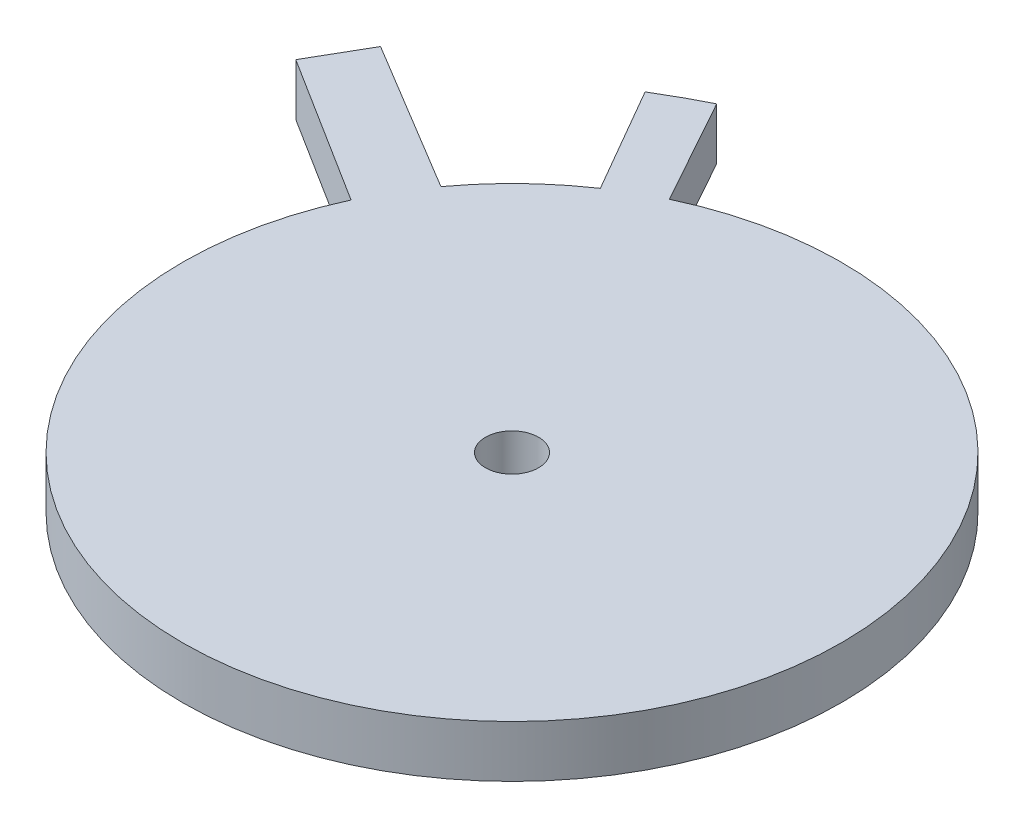
ISO-10303-21;
HEADER;
FILE_DESCRIPTION(('STEP AP214'),'2;1');
FILE_NAME('part.step','',(''),(''),'','','');
FILE_SCHEMA(('AUTOMOTIVE_DESIGN { 1 0 10303 214 1 1 1 1 }'));
ENDSEC;
DATA;
#1=APPLICATION_CONTEXT('core data for automotive mechanical design processes');
#2=APPLICATION_PROTOCOL_DEFINITION('international standard','automotive_design',2000,#1);
#3=PRODUCT_CONTEXT('',#1,'mechanical');
#4=PRODUCT('Part','Part','',(#3));
#5=PRODUCT_RELATED_PRODUCT_CATEGORY('part','',(#4));
#6=PRODUCT_DEFINITION_FORMATION('','',#4);
#7=PRODUCT_DEFINITION_CONTEXT('part definition',#1,'design');
#8=PRODUCT_DEFINITION('design','',#6,#7);
#9=PRODUCT_DEFINITION_SHAPE('','',#8);
#10=(LENGTH_UNIT() NAMED_UNIT(*) SI_UNIT(.MILLI.,.METRE.));
#11=(NAMED_UNIT(*) PLANE_ANGLE_UNIT() SI_UNIT($,.RADIAN.));
#12=(NAMED_UNIT(*) SI_UNIT($,.STERADIAN.) SOLID_ANGLE_UNIT());
#13=UNCERTAINTY_MEASURE_WITH_UNIT(LENGTH_MEASURE(1.E-05),#10,'distance_accuracy_value','');
#14=(GEOMETRIC_REPRESENTATION_CONTEXT(3) GLOBAL_UNCERTAINTY_ASSIGNED_CONTEXT((#13)) GLOBAL_UNIT_ASSIGNED_CONTEXT((#10,
#11,#12)) REPRESENTATION_CONTEXT('',''));
#15=CARTESIAN_POINT('',(0.,0.,0.));
#16=DIRECTION('',(0.,0.,1.));
#17=DIRECTION('',(1.,0.,0.));
#18=AXIS2_PLACEMENT_3D('',#15,#16,#17);
#19=CARTESIAN_POINT('',(0.,10.,0.));
#20=DIRECTION('',(0.,1.,0.));
#21=DIRECTION('',(0.,0.,1.));
#22=AXIS2_PLACEMENT_3D('',#19,#20,#21);
#23=PLANE('',#22);
#24=DIRECTION('',(-0.499999999999994,0.,0.866025403784442));
#25=VECTOR('',#24,1.);
#26=CARTESIAN_POINT('',(-83.7727354060045,10.,-49.2803875308786));
#27=LINE('',#26,#25);
#28=CARTESIAN_POINT('',(-80.4200623646265,10.,-55.0873875797118));
#29=VERTEX_POINT('',#28);
#30=CARTESIAN_POINT('',(-86.399180333925,10.,-44.7312514724386));
#31=VERTEX_POINT('',#30);
#32=EDGE_CURVE('E95',#29,#31,#27,.T.);
#33=ORIENTED_EDGE('',*,*,#32,.T.);
#34=DIRECTION('',(0.846296013395685,0.,0.532712922417478));
#35=VECTOR('',#34,1.);
#36=CARTESIAN_POINT('',(-86.399180333925,10.,-44.7312514724386));
#37=LINE('',#36,#35);
#38=CARTESIAN_POINT('',(-57.6454412604901,10.,-26.6318062076794));
#39=VERTEX_POINT('',#38);
#40=EDGE_CURVE('E193',#31,#39,#37,.T.);
#41=ORIENTED_EDGE('',*,*,#40,.T.);
#42=CARTESIAN_POINT('',(0.,10.,0.));
#43=DIRECTION('',(0.,1.,0.));
#44=DIRECTION('',(0.,0.,1.));
#45=AXIS2_PLACEMENT_3D('',#42,#43,#44);
#46=CIRCLE('',#45,63.5);
#47=CARTESIAN_POINT('',(-27.0950229738358,10.,-57.4291714205186));
#48=VERTEX_POINT('',#47);
#49=EDGE_CURVE('E171',#39,#48,#46,.T.);
#50=ORIENTED_EDGE('',*,*,#49,.T.);
#51=DIRECTION('',(-0.48544109619429,0.,-0.874269376179725));
#52=VECTOR('',#51,1.);
#53=CARTESIAN_POINT('',(-38.4635532053766,10.,-77.9036592863574));
#54=LINE('',#53,#52);
#55=CARTESIAN_POINT('',(-38.4635532053766,10.,-77.9036592863574));
#56=VERTEX_POINT('',#55);
#57=EDGE_CURVE('E188',#48,#56,#54,.T.);
#58=ORIENTED_EDGE('',*,*,#57,.T.);
#59=DIRECTION('',(-0.886917672258322,0.,0.461927529636284));
#60=VECTOR('',#59,1.);
#61=CARTESIAN_POINT('',(-42.6242669557848,10.,-75.7366619602629));
#62=LINE('',#61,#60);
#63=CARTESIAN_POINT('',(-42.6242669557848,10.,-75.7366619602629));
#64=VERTEX_POINT('',#63);
#65=EDGE_CURVE('E187',#56,#64,#62,.T.);
#66=ORIENTED_EDGE('',*,*,#65,.T.);
#67=DIRECTION('',(-0.866025403784436,0.,0.500000000000005));
#68=VECTOR('',#67,1.);
#69=CARTESIAN_POINT('',(-42.6242669557848,10.,-75.7366619602629));
#70=LINE('',#69,#68);
#71=CARTESIAN_POINT('',(-47.3596011704649,10.,-73.0027154767144));
#72=VERTEX_POINT('',#71);
#73=EDGE_CURVE('E118',#64,#72,#70,.T.);
#74=ORIENTED_EDGE('',*,*,#73,.T.);
#75=DIRECTION('',(0.500000000000005,0.,0.866025403784436));
#76=VECTOR('',#75,1.);
#77=CARTESIAN_POINT('',(-47.3596011704649,10.,-73.0027154767144));
#78=LINE('',#77,#76);
#79=CARTESIAN_POINT('',(-35.5783013241968,10.,-52.5969055637749));
#80=VERTEX_POINT('',#79);
#81=EDGE_CURVE('E112',#72,#80,#78,.T.);
#82=ORIENTED_EDGE('',*,*,#81,.T.);
#83=CARTESIAN_POINT('',(0.,10.,0.));
#84=DIRECTION('',(0.,1.,0.));
#85=DIRECTION('',(0.,0.,1.));
#86=AXIS2_PLACEMENT_3D('',#83,#84,#85);
#87=CIRCLE('',#86,63.5);
#88=CARTESIAN_POINT('',(-51.2246725156956,10.,-37.5270958863025));
#89=VERTEX_POINT('',#88);
#90=EDGE_CURVE('E116',#80,#89,#87,.T.);
#91=ORIENTED_EDGE('',*,*,#90,.T.);
#92=DIRECTION('',(-0.856934854553047,0.,-0.515424732674082));
#93=VECTOR('',#92,1.);
#94=CARTESIAN_POINT('',(-80.4200623646265,10.,-55.0873875797118));
#95=LINE('',#94,#93);
#96=EDGE_CURVE('E50',#89,#29,#95,.T.);
#97=ORIENTED_EDGE('',*,*,#96,.T.);
#98=EDGE_LOOP('',(#33,#41,#50,#58,#66,#74,#82,#91,#97));
#99=FACE_BOUND('',#98,.T.);
#100=CARTESIAN_POINT('',(0.,10.,0.));
#101=DIRECTION('',(0.,1.,0.));
#102=DIRECTION('',(0.,0.,1.));
#103=AXIS2_PLACEMENT_3D('',#100,#101,#102);
#104=CIRCLE('',#103,5.11428437233284);
#105=CARTESIAN_POINT('',(0.,10.,5.11428437233284));
#106=VERTEX_POINT('',#105);
#107=EDGE_CURVE('E138',#106,#106,#104,.T.);
#108=ORIENTED_EDGE('',*,*,#107,.F.);
#109=EDGE_LOOP('',(#108));
#110=FACE_BOUND('',#109,.T.);
#111=ADVANCED_FACE('F33',(#99,#110),#23,.T.);
#112=CARTESIAN_POINT('',(0.,0.,0.));
#113=DIRECTION('',(0.,1.,0.));
#114=DIRECTION('',(0.,0.,1.));
#115=AXIS2_PLACEMENT_3D('',#112,#113,#114);
#116=PLANE('',#115);
#117=DIRECTION('',(-0.499999999999994,0.,0.866025403784442));
#118=VECTOR('',#117,1.);
#119=CARTESIAN_POINT('',(-83.7727354060045,0.,-49.2803875308786));
#120=LINE('',#119,#118);
#121=CARTESIAN_POINT('',(-80.4200623646265,0.,-55.0873875797118));
#122=VERTEX_POINT('',#121);
#123=CARTESIAN_POINT('',(-86.399180333925,0.,-44.7312514724386));
#124=VERTEX_POINT('',#123);
#125=EDGE_CURVE('E89',#122,#124,#120,.T.);
#126=ORIENTED_EDGE('',*,*,#125,.F.);
#127=DIRECTION('',(-0.856934854553047,0.,-0.515424732674082));
#128=VECTOR('',#127,1.);
#129=CARTESIAN_POINT('',(-80.4200623646265,0.,-55.0873875797118));
#130=LINE('',#129,#128);
#131=CARTESIAN_POINT('',(-51.2246725156956,0.,-37.5270958863025));
#132=VERTEX_POINT('',#131);
#133=EDGE_CURVE('E150',#132,#122,#130,.T.);
#134=ORIENTED_EDGE('',*,*,#133,.F.);
#135=CARTESIAN_POINT('',(0.,0.,0.));
#136=DIRECTION('',(0.,1.,0.));
#137=DIRECTION('',(0.,0.,1.));
#138=AXIS2_PLACEMENT_3D('',#135,#136,#137);
#139=CIRCLE('',#138,63.5);
#140=CARTESIAN_POINT('',(-35.5783013241968,0.,-52.5969055637749));
#141=VERTEX_POINT('',#140);
#142=EDGE_CURVE('E82',#141,#132,#139,.T.);
#143=ORIENTED_EDGE('',*,*,#142,.F.);
#144=DIRECTION('',(0.500000000000005,0.,0.866025403784436));
#145=VECTOR('',#144,1.);
#146=CARTESIAN_POINT('',(-47.3596011704649,0.,-73.0027154767144));
#147=LINE('',#146,#145);
#148=CARTESIAN_POINT('',(-47.3596011704649,0.,-73.0027154767144));
#149=VERTEX_POINT('',#148);
#150=EDGE_CURVE('E126',#149,#141,#147,.T.);
#151=ORIENTED_EDGE('',*,*,#150,.F.);
#152=DIRECTION('',(-0.866025403784436,0.,0.500000000000005));
#153=VECTOR('',#152,1.);
#154=CARTESIAN_POINT('',(-42.6242669557848,0.,-75.7366619602629));
#155=LINE('',#154,#153);
#156=CARTESIAN_POINT('',(-42.6242669557848,0.,-75.7366619602629));
#157=VERTEX_POINT('',#156);
#158=EDGE_CURVE('E146',#157,#149,#155,.T.);
#159=ORIENTED_EDGE('',*,*,#158,.F.);
#160=DIRECTION('',(-0.886917672258322,0.,0.461927529636284));
#161=VECTOR('',#160,1.);
#162=CARTESIAN_POINT('',(-42.6242669557848,0.,-75.7366619602629));
#163=LINE('',#162,#161);
#164=CARTESIAN_POINT('',(-38.4635532053766,0.,-77.9036592863574));
#165=VERTEX_POINT('',#164);
#166=EDGE_CURVE('E144',#165,#157,#163,.T.);
#167=ORIENTED_EDGE('',*,*,#166,.F.);
#168=DIRECTION('',(-0.48544109619429,0.,-0.874269376179725));
#169=VECTOR('',#168,1.);
#170=CARTESIAN_POINT('',(-38.4635532053766,0.,-77.9036592863574));
#171=LINE('',#170,#169);
#172=CARTESIAN_POINT('',(-27.0950229738358,0.,-57.4291714205186));
#173=VERTEX_POINT('',#172);
#174=EDGE_CURVE('E142',#173,#165,#171,.T.);
#175=ORIENTED_EDGE('',*,*,#174,.F.);
#176=CARTESIAN_POINT('',(0.,0.,0.));
#177=DIRECTION('',(0.,1.,0.));
#178=DIRECTION('',(0.,0.,1.));
#179=AXIS2_PLACEMENT_3D('',#176,#177,#178);
#180=CIRCLE('',#179,63.5);
#181=CARTESIAN_POINT('',(-57.6454412604901,0.,-26.6318062076794));
#182=VERTEX_POINT('',#181);
#183=EDGE_CURVE('E140',#182,#173,#180,.T.);
#184=ORIENTED_EDGE('',*,*,#183,.F.);
#185=DIRECTION('',(0.846296013395685,0.,0.532712922417478));
#186=VECTOR('',#185,1.);
#187=CARTESIAN_POINT('',(-86.399180333925,0.,-44.7312514724386));
#188=LINE('',#187,#186);
#189=EDGE_CURVE('E137',#124,#182,#188,.T.);
#190=ORIENTED_EDGE('',*,*,#189,.F.);
#191=EDGE_LOOP('',(#126,#134,#143,#151,#159,#167,#175,#184,#190));
#192=FACE_BOUND('',#191,.T.);
#193=CARTESIAN_POINT('',(0.,0.,0.));
#194=DIRECTION('',(0.,1.,0.));
#195=DIRECTION('',(0.,0.,1.));
#196=AXIS2_PLACEMENT_3D('',#193,#194,#195);
#197=CIRCLE('',#196,5.11428437233284);
#198=CARTESIAN_POINT('',(0.,0.,5.11428437233284));
#199=VERTEX_POINT('',#198);
#200=EDGE_CURVE('E196',#199,#199,#197,.T.);
#201=ORIENTED_EDGE('',*,*,#200,.T.);
#202=EDGE_LOOP('',(#201));
#203=FACE_BOUND('',#202,.T.);
#204=ADVANCED_FACE('F175',(#192,#203),#116,.F.);
#205=CARTESIAN_POINT('',(-83.7727354060045,10.,-49.2803875308786));
#206=DIRECTION('',(0.866025403784442,0.,0.499999999999994));
#207=DIRECTION('',(0.499999999999994,0.,-0.866025403784442));
#208=AXIS2_PLACEMENT_3D('',#205,#206,#207);
#209=PLANE('',#208);
#210=ORIENTED_EDGE('',*,*,#125,.T.);
#211=DIRECTION('',(0.,-1.,0.));
#212=VECTOR('',#211,1.);
#213=CARTESIAN_POINT('',(-86.399180333925,10.,-44.7312514724386));
#214=LINE('',#213,#212);
#215=EDGE_CURVE('E11',#31,#124,#214,.T.);
#216=ORIENTED_EDGE('',*,*,#215,.F.);
#217=ORIENTED_EDGE('',*,*,#32,.F.);
#218=DIRECTION('',(0.,-1.,0.));
#219=VECTOR('',#218,1.);
#220=CARTESIAN_POINT('',(-80.4200623646265,10.,-55.0873875797118));
#221=LINE('',#220,#219);
#222=EDGE_CURVE('E132',#29,#122,#221,.T.);
#223=ORIENTED_EDGE('',*,*,#222,.T.);
#224=EDGE_LOOP('',(#210,#216,#217,#223));
#225=FACE_BOUND('',#224,.T.);
#226=ADVANCED_FACE('F35',(#225),#209,.F.);
#227=CARTESIAN_POINT('',(-86.399180333925,10.,-44.7312514724386));
#228=DIRECTION('',(0.532712922417478,0.,-0.846296013395685));
#229=DIRECTION('',(-0.846296013395685,0.,-0.532712922417478));
#230=AXIS2_PLACEMENT_3D('',#227,#228,#229);
#231=PLANE('',#230);
#232=ORIENTED_EDGE('',*,*,#189,.T.);
#233=DIRECTION('',(0.,-1.,0.));
#234=VECTOR('',#233,1.);
#235=CARTESIAN_POINT('',(-57.6454412604901,10.,-26.6318062076794));
#236=LINE('',#235,#234);
#237=EDGE_CURVE('E42',#39,#182,#236,.T.);
#238=ORIENTED_EDGE('',*,*,#237,.F.);
#239=ORIENTED_EDGE('',*,*,#40,.F.);
#240=ORIENTED_EDGE('',*,*,#215,.T.);
#241=EDGE_LOOP('',(#232,#238,#239,#240));
#242=FACE_BOUND('',#241,.T.);
#243=ADVANCED_FACE('F229',(#242),#231,.F.);
#244=CARTESIAN_POINT('',(0.,10.,0.));
#245=DIRECTION('',(0.,-1.,0.));
#246=DIRECTION('',(0.,0.,-1.));
#247=AXIS2_PLACEMENT_3D('',#244,#245,#246);
#248=CYLINDRICAL_SURFACE('',#247,63.5);
#249=ORIENTED_EDGE('',*,*,#183,.T.);
#250=DIRECTION('',(0.,-1.,0.));
#251=VECTOR('',#250,1.);
#252=CARTESIAN_POINT('',(-27.0950229738358,10.,-57.4291714205186));
#253=LINE('',#252,#251);
#254=EDGE_CURVE('E162',#48,#173,#253,.T.);
#255=ORIENTED_EDGE('',*,*,#254,.F.);
#256=ORIENTED_EDGE('',*,*,#49,.F.);
#257=ORIENTED_EDGE('',*,*,#237,.T.);
#258=EDGE_LOOP('',(#249,#255,#256,#257));
#259=FACE_BOUND('',#258,.T.);
#260=ADVANCED_FACE('F169',(#259),#248,.T.);
#261=CARTESIAN_POINT('',(-38.4635532053766,10.,-77.9036592863574));
#262=DIRECTION('',(-0.874269376179725,0.,0.48544109619429));
#263=DIRECTION('',(0.48544109619429,0.,0.874269376179725));
#264=AXIS2_PLACEMENT_3D('',#261,#262,#263);
#265=PLANE('',#264);
#266=ORIENTED_EDGE('',*,*,#174,.T.);
#267=DIRECTION('',(0.,-1.,0.));
#268=VECTOR('',#267,1.);
#269=CARTESIAN_POINT('',(-38.4635532053766,10.,-77.9036592863574));
#270=LINE('',#269,#268);
#271=EDGE_CURVE('E159',#56,#165,#270,.T.);
#272=ORIENTED_EDGE('',*,*,#271,.F.);
#273=ORIENTED_EDGE('',*,*,#57,.F.);
#274=ORIENTED_EDGE('',*,*,#254,.T.);
#275=EDGE_LOOP('',(#266,#272,#273,#274));
#276=FACE_BOUND('',#275,.T.);
#277=ADVANCED_FACE('F181',(#276),#265,.F.);
#278=CARTESIAN_POINT('',(-42.6242669557848,10.,-75.7366619602629));
#279=DIRECTION('',(0.461927529636284,0.,0.886917672258322));
#280=DIRECTION('',(0.886917672258322,0.,-0.461927529636284));
#281=AXIS2_PLACEMENT_3D('',#278,#279,#280);
#282=PLANE('',#281);
#283=ORIENTED_EDGE('',*,*,#166,.T.);
#284=DIRECTION('',(0.,-1.,0.));
#285=VECTOR('',#284,1.);
#286=CARTESIAN_POINT('',(-42.6242669557848,10.,-75.7366619602629));
#287=LINE('',#286,#285);
#288=EDGE_CURVE('E156',#64,#157,#287,.T.);
#289=ORIENTED_EDGE('',*,*,#288,.F.);
#290=ORIENTED_EDGE('',*,*,#65,.F.);
#291=ORIENTED_EDGE('',*,*,#271,.T.);
#292=EDGE_LOOP('',(#283,#289,#290,#291));
#293=FACE_BOUND('',#292,.T.);
#294=ADVANCED_FACE('F185',(#293),#282,.F.);
#295=CARTESIAN_POINT('',(-42.6242669557848,10.,-75.7366619602629));
#296=DIRECTION('',(0.500000000000005,0.,0.866025403784436));
#297=DIRECTION('',(0.866025403784436,0.,-0.500000000000005));
#298=AXIS2_PLACEMENT_3D('',#295,#296,#297);
#299=PLANE('',#298);
#300=ORIENTED_EDGE('',*,*,#158,.T.);
#301=DIRECTION('',(0.,-1.,0.));
#302=VECTOR('',#301,1.);
#303=CARTESIAN_POINT('',(-47.3596011704649,10.,-73.0027154767144));
#304=LINE('',#303,#302);
#305=EDGE_CURVE('E127',#72,#149,#304,.T.);
#306=ORIENTED_EDGE('',*,*,#305,.F.);
#307=ORIENTED_EDGE('',*,*,#73,.F.);
#308=ORIENTED_EDGE('',*,*,#288,.T.);
#309=EDGE_LOOP('',(#300,#306,#307,#308));
#310=FACE_BOUND('',#309,.T.);
#311=ADVANCED_FACE('F220',(#310),#299,.F.);
#312=CARTESIAN_POINT('',(-47.3596011704649,10.,-73.0027154767144));
#313=DIRECTION('',(0.866025403784436,0.,-0.500000000000005));
#314=DIRECTION('',(-0.500000000000005,0.,-0.866025403784436));
#315=AXIS2_PLACEMENT_3D('',#312,#313,#314);
#316=PLANE('',#315);
#317=ORIENTED_EDGE('',*,*,#150,.T.);
#318=DIRECTION('',(0.,-1.,0.));
#319=VECTOR('',#318,1.);
#320=CARTESIAN_POINT('',(-35.5783013241968,10.,-52.5969055637749));
#321=LINE('',#320,#319);
#322=EDGE_CURVE('E123',#80,#141,#321,.T.);
#323=ORIENTED_EDGE('',*,*,#322,.F.);
#324=ORIENTED_EDGE('',*,*,#81,.F.);
#325=ORIENTED_EDGE('',*,*,#305,.T.);
#326=EDGE_LOOP('',(#317,#323,#324,#325));
#327=FACE_BOUND('',#326,.T.);
#328=ADVANCED_FACE('F124',(#327),#316,.F.);
#329=CARTESIAN_POINT('',(0.,10.,0.));
#330=DIRECTION('',(0.,-1.,0.));
#331=DIRECTION('',(0.,0.,-1.));
#332=AXIS2_PLACEMENT_3D('',#329,#330,#331);
#333=CYLINDRICAL_SURFACE('',#332,63.5);
#334=ORIENTED_EDGE('',*,*,#142,.T.);
#335=DIRECTION('',(0.,-1.,0.));
#336=VECTOR('',#335,1.);
#337=CARTESIAN_POINT('',(-51.2246725156956,10.,-37.5270958863025));
#338=LINE('',#337,#336);
#339=EDGE_CURVE('E128',#89,#132,#338,.T.);
#340=ORIENTED_EDGE('',*,*,#339,.F.);
#341=ORIENTED_EDGE('',*,*,#90,.F.);
#342=ORIENTED_EDGE('',*,*,#322,.T.);
#343=EDGE_LOOP('',(#334,#340,#341,#342));
#344=FACE_BOUND('',#343,.T.);
#345=ADVANCED_FACE('F130',(#344),#333,.T.);
#346=CARTESIAN_POINT('',(-80.4200623646265,10.,-55.0873875797118));
#347=DIRECTION('',(-0.515424732674082,0.,0.856934854553047));
#348=DIRECTION('',(0.856934854553047,0.,0.515424732674082));
#349=AXIS2_PLACEMENT_3D('',#346,#347,#348);
#350=PLANE('',#349);
#351=ORIENTED_EDGE('',*,*,#133,.T.);
#352=ORIENTED_EDGE('',*,*,#222,.F.);
#353=ORIENTED_EDGE('',*,*,#96,.F.);
#354=ORIENTED_EDGE('',*,*,#339,.T.);
#355=EDGE_LOOP('',(#351,#352,#353,#354));
#356=FACE_BOUND('',#355,.T.);
#357=ADVANCED_FACE('F212',(#356),#350,.F.);
#358=CARTESIAN_POINT('',(0.,10.,0.));
#359=DIRECTION('',(0.,-1.,0.));
#360=DIRECTION('',(0.,0.,-1.));
#361=AXIS2_PLACEMENT_3D('',#358,#359,#360);
#362=CYLINDRICAL_SURFACE('',#361,5.11428437233284);
#363=ORIENTED_EDGE('',*,*,#107,.T.);
#364=EDGE_LOOP('',(#363));
#365=FACE_BOUND('',#364,.T.);
#366=ORIENTED_EDGE('',*,*,#200,.F.);
#367=EDGE_LOOP('',(#366));
#368=FACE_BOUND('',#367,.T.);
#369=ADVANCED_FACE('F202',(#365,#368),#362,.F.);
#370=CLOSED_SHELL('',(#111,#204,#226,#243,#260,#277,#294,#311,#328,#345,#357,#369));
#371=MANIFOLD_SOLID_BREP('B2',#370);
#372=ADVANCED_BREP_SHAPE_REPRESENTATION('',(#18,#371),#14);
#373=SHAPE_DEFINITION_REPRESENTATION(#9,#372);
ENDSEC;
END-ISO-10303-21;
